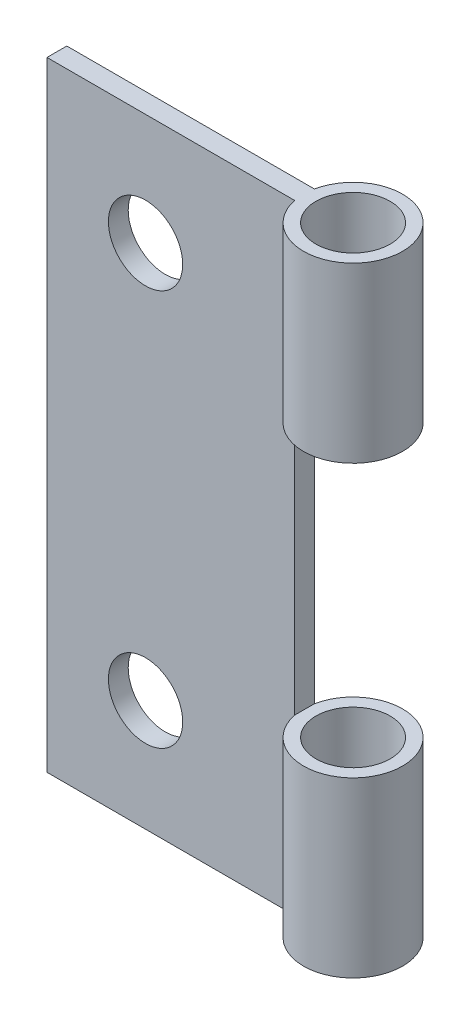
ISO-10303-21;
HEADER;
FILE_DESCRIPTION(('STEP AP214'),'2;1');
FILE_NAME('part.step','',(''),(''),'','','');
FILE_SCHEMA(('AUTOMOTIVE_DESIGN { 1 0 10303 214 1 1 1 1 }'));
ENDSEC;
DATA;
#1=APPLICATION_CONTEXT('core data for automotive mechanical design processes');
#2=APPLICATION_PROTOCOL_DEFINITION('international standard','automotive_design',2000,#1);
#3=PRODUCT_CONTEXT('',#1,'mechanical');
#4=PRODUCT('Part','Part','',(#3));
#5=PRODUCT_RELATED_PRODUCT_CATEGORY('part','',(#4));
#6=PRODUCT_DEFINITION_FORMATION('','',#4);
#7=PRODUCT_DEFINITION_CONTEXT('part definition',#1,'design');
#8=PRODUCT_DEFINITION('design','',#6,#7);
#9=PRODUCT_DEFINITION_SHAPE('','',#8);
#10=(LENGTH_UNIT() NAMED_UNIT(*) SI_UNIT(.MILLI.,.METRE.));
#11=(NAMED_UNIT(*) PLANE_ANGLE_UNIT() SI_UNIT($,.RADIAN.));
#12=(NAMED_UNIT(*) SI_UNIT($,.STERADIAN.) SOLID_ANGLE_UNIT());
#13=UNCERTAINTY_MEASURE_WITH_UNIT(LENGTH_MEASURE(1.E-05),#10,'distance_accuracy_value','');
#14=(GEOMETRIC_REPRESENTATION_CONTEXT(3) GLOBAL_UNCERTAINTY_ASSIGNED_CONTEXT((#13)) GLOBAL_UNIT_ASSIGNED_CONTEXT((#10,
#11,#12)) REPRESENTATION_CONTEXT('',''));
#15=CARTESIAN_POINT('',(0.,0.,0.));
#16=DIRECTION('',(0.,0.,1.));
#17=DIRECTION('',(1.,0.,0.));
#18=AXIS2_PLACEMENT_3D('',#15,#16,#17);
#19=CARTESIAN_POINT('',(5.,-12.5,0.8));
#20=DIRECTION('',(-1.,0.,0.));
#21=DIRECTION('',(0.,0.,1.));
#22=AXIS2_PLACEMENT_3D('',#19,#20,#21);
#23=PLANE('',#22);
#24=DIRECTION('',(0.,0.,-1.));
#25=VECTOR('',#24,1.);
#26=CARTESIAN_POINT('',(5.,5.5,0.8));
#27=LINE('',#26,#25);
#28=CARTESIAN_POINT('',(5.,5.5,0.8));
#29=VERTEX_POINT('',#28);
#30=CARTESIAN_POINT('',(5.,5.5,0.));
#31=VERTEX_POINT('',#30);
#32=EDGE_CURVE('E54',#29,#31,#27,.T.);
#33=ORIENTED_EDGE('',*,*,#32,.F.);
#34=DIRECTION('',(0.,1.,0.));
#35=VECTOR('',#34,1.);
#36=CARTESIAN_POINT('',(5.,-12.5,0.8));
#37=LINE('',#36,#35);
#38=CARTESIAN_POINT('',(5.,-5.5,0.8));
#39=VERTEX_POINT('',#38);
#40=EDGE_CURVE('E143',#39,#29,#37,.T.);
#41=ORIENTED_EDGE('',*,*,#40,.F.);
#42=DIRECTION('',(0.,0.,1.));
#43=VECTOR('',#42,1.);
#44=CARTESIAN_POINT('',(5.,-5.5,0.8));
#45=LINE('',#44,#43);
#46=CARTESIAN_POINT('',(5.,-5.5,0.));
#47=VERTEX_POINT('',#46);
#48=EDGE_CURVE('E109',#47,#39,#45,.T.);
#49=ORIENTED_EDGE('',*,*,#48,.F.);
#50=DIRECTION('',(0.,1.,0.));
#51=VECTOR('',#50,1.);
#52=CARTESIAN_POINT('',(5.,-12.5,0.));
#53=LINE('',#52,#51);
#54=EDGE_CURVE('E108',#47,#31,#53,.T.);
#55=ORIENTED_EDGE('',*,*,#54,.T.);
#56=EDGE_LOOP('',(#33,#41,#49,#55));
#57=FACE_BOUND('',#56,.T.);
#58=ADVANCED_FACE('F40',(#57),#23,.F.);
#59=CARTESIAN_POINT('',(-5.,12.5,0.8));
#60=DIRECTION('',(0.,-1.,0.));
#61=DIRECTION('',(0.,0.,-1.));
#62=AXIS2_PLACEMENT_3D('',#59,#60,#61);
#63=PLANE('',#62);
#64=DIRECTION('',(-1.,0.,0.));
#65=VECTOR('',#64,1.);
#66=CARTESIAN_POINT('',(-5.,12.5,0.8));
#67=LINE('',#66,#65);
#68=CARTESIAN_POINT('',(5.,12.5,0.8));
#69=VERTEX_POINT('',#68);
#70=CARTESIAN_POINT('',(-5.,12.5,0.8));
#71=VERTEX_POINT('',#70);
#72=EDGE_CURVE('E114',#69,#71,#67,.T.);
#73=ORIENTED_EDGE('',*,*,#72,.F.);
#74=CARTESIAN_POINT('',(6.95959179422654,12.5,0.4));
#75=DIRECTION('',(0.,-1.,0.));
#76=DIRECTION('',(0.,0.,-1.));
#77=AXIS2_PLACEMENT_3D('',#74,#75,#76);
#78=CIRCLE('',#77,2.);
#79=CARTESIAN_POINT('',(5.,12.5,0.));
#80=VERTEX_POINT('',#79);
#81=EDGE_CURVE('E105',#80,#69,#78,.T.);
#82=ORIENTED_EDGE('',*,*,#81,.F.);
#83=DIRECTION('',(-1.,0.,0.));
#84=VECTOR('',#83,1.);
#85=CARTESIAN_POINT('',(-5.,12.5,0.));
#86=LINE('',#85,#84);
#87=CARTESIAN_POINT('',(-5.,12.5,0.));
#88=VERTEX_POINT('',#87);
#89=EDGE_CURVE('E90',#80,#88,#86,.T.);
#90=ORIENTED_EDGE('',*,*,#89,.T.);
#91=DIRECTION('',(0.,0.,-1.));
#92=VECTOR('',#91,1.);
#93=CARTESIAN_POINT('',(-5.,12.5,0.8));
#94=LINE('',#93,#92);
#95=EDGE_CURVE('E11',#71,#88,#94,.T.);
#96=ORIENTED_EDGE('',*,*,#95,.F.);
#97=EDGE_LOOP('',(#73,#82,#90,#96));
#98=FACE_BOUND('',#97,.T.);
#99=CARTESIAN_POINT('',(6.95959179422654,12.5,0.4));
#100=DIRECTION('',(0.,-1.,0.));
#101=DIRECTION('',(0.,0.,-1.));
#102=AXIS2_PLACEMENT_3D('',#99,#100,#101);
#103=CIRCLE('',#102,1.5);
#104=CARTESIAN_POINT('',(6.95959179422654,12.5,-1.1));
#105=VERTEX_POINT('',#104);
#106=EDGE_CURVE('E120',#105,#105,#103,.T.);
#107=ORIENTED_EDGE('',*,*,#106,.T.);
#108=EDGE_LOOP('',(#107));
#109=FACE_BOUND('',#108,.T.);
#110=ADVANCED_FACE('F112',(#98,#109),#63,.F.);
#111=CARTESIAN_POINT('',(-5.,-12.5,0.8));
#112=DIRECTION('',(1.,0.,0.));
#113=DIRECTION('',(0.,0.,-1.));
#114=AXIS2_PLACEMENT_3D('',#111,#112,#113);
#115=PLANE('',#114);
#116=DIRECTION('',(0.,-1.,0.));
#117=VECTOR('',#116,1.);
#118=CARTESIAN_POINT('',(-5.,-12.5,0.));
#119=LINE('',#118,#117);
#120=CARTESIAN_POINT('',(-5.,-12.5,0.));
#121=VERTEX_POINT('',#120);
#122=EDGE_CURVE('E94',#88,#121,#119,.T.);
#123=ORIENTED_EDGE('',*,*,#122,.T.);
#124=DIRECTION('',(0.,0.,-1.));
#125=VECTOR('',#124,1.);
#126=CARTESIAN_POINT('',(-5.,-12.5,0.8));
#127=LINE('',#126,#125);
#128=CARTESIAN_POINT('',(-5.,-12.5,0.8));
#129=VERTEX_POINT('',#128);
#130=EDGE_CURVE('E47',#129,#121,#127,.T.);
#131=ORIENTED_EDGE('',*,*,#130,.F.);
#132=DIRECTION('',(0.,-1.,0.));
#133=VECTOR('',#132,1.);
#134=CARTESIAN_POINT('',(-5.,-12.5,0.8));
#135=LINE('',#134,#133);
#136=EDGE_CURVE('E145',#71,#129,#135,.T.);
#137=ORIENTED_EDGE('',*,*,#136,.F.);
#138=ORIENTED_EDGE('',*,*,#95,.T.);
#139=EDGE_LOOP('',(#123,#131,#137,#138));
#140=FACE_BOUND('',#139,.T.);
#141=ADVANCED_FACE('F190',(#140),#115,.F.);
#142=CARTESIAN_POINT('',(-5.,-12.5,0.8));
#143=DIRECTION('',(0.,1.,0.));
#144=DIRECTION('',(0.,0.,1.));
#145=AXIS2_PLACEMENT_3D('',#142,#143,#144);
#146=PLANE('',#145);
#147=DIRECTION('',(1.,0.,0.));
#148=VECTOR('',#147,1.);
#149=CARTESIAN_POINT('',(-5.,-12.5,0.));
#150=LINE('',#149,#148);
#151=CARTESIAN_POINT('',(5.,-12.5,0.));
#152=VERTEX_POINT('',#151);
#153=EDGE_CURVE('E151',#121,#152,#150,.T.);
#154=ORIENTED_EDGE('',*,*,#153,.T.);
#155=CARTESIAN_POINT('',(6.95959179422654,-12.5,0.4));
#156=DIRECTION('',(0.,-1.,0.));
#157=DIRECTION('',(0.,0.,-1.));
#158=AXIS2_PLACEMENT_3D('',#155,#156,#157);
#159=CIRCLE('',#158,2.);
#160=CARTESIAN_POINT('',(5.,-12.5,0.8));
#161=VERTEX_POINT('',#160);
#162=EDGE_CURVE('E130',#152,#161,#159,.T.);
#163=ORIENTED_EDGE('',*,*,#162,.T.);
#164=DIRECTION('',(1.,0.,0.));
#165=VECTOR('',#164,1.);
#166=CARTESIAN_POINT('',(-5.,-12.5,0.8));
#167=LINE('',#166,#165);
#168=EDGE_CURVE('E147',#129,#161,#167,.T.);
#169=ORIENTED_EDGE('',*,*,#168,.F.);
#170=ORIENTED_EDGE('',*,*,#130,.T.);
#171=EDGE_LOOP('',(#154,#163,#169,#170));
#172=FACE_BOUND('',#171,.T.);
#173=CARTESIAN_POINT('',(6.95959179422654,-12.5,0.4));
#174=DIRECTION('',(0.,-1.,0.));
#175=DIRECTION('',(0.,0.,-1.));
#176=AXIS2_PLACEMENT_3D('',#173,#174,#175);
#177=CIRCLE('',#176,1.5);
#178=CARTESIAN_POINT('',(6.95959179422654,-12.5,-1.1));
#179=VERTEX_POINT('',#178);
#180=EDGE_CURVE('E126',#179,#179,#177,.T.);
#181=ORIENTED_EDGE('',*,*,#180,.F.);
#182=EDGE_LOOP('',(#181));
#183=FACE_BOUND('',#182,.T.);
#184=ADVANCED_FACE('F156',(#172,#183),#146,.F.);
#185=CARTESIAN_POINT('',(0.,0.,0.8));
#186=DIRECTION('',(0.,0.,-1.));
#187=DIRECTION('',(-1.,0.,0.));
#188=AXIS2_PLACEMENT_3D('',#185,#186,#187);
#189=PLANE('',#188);
#190=CARTESIAN_POINT('',(-1.02020410288673,8.,0.8));
#191=DIRECTION('',(0.,0.,1.));
#192=DIRECTION('',(1.,0.,0.));
#193=AXIS2_PLACEMENT_3D('',#190,#191,#192);
#194=CIRCLE('',#193,1.5);
#195=CARTESIAN_POINT('',(0.479795897113271,8.,0.8));
#196=VERTEX_POINT('',#195);
#197=EDGE_CURVE('E336',#196,#196,#194,.T.);
#198=ORIENTED_EDGE('',*,*,#197,.F.);
#199=EDGE_LOOP('',(#198));
#200=FACE_BOUND('',#199,.T.);
#201=CARTESIAN_POINT('',(-1.02020410288673,-8.,0.8));
#202=DIRECTION('',(0.,0.,1.));
#203=DIRECTION('',(1.,0.,0.));
#204=AXIS2_PLACEMENT_3D('',#201,#202,#203);
#205=CIRCLE('',#204,1.5);
#206=CARTESIAN_POINT('',(0.479795897113271,-8.,0.8));
#207=VERTEX_POINT('',#206);
#208=EDGE_CURVE('E342',#207,#207,#205,.T.);
#209=ORIENTED_EDGE('',*,*,#208,.F.);
#210=EDGE_LOOP('',(#209));
#211=FACE_BOUND('',#210,.T.);
#212=EDGE_CURVE('E140',#161,#39,#37,.T.);
#213=ORIENTED_EDGE('',*,*,#212,.T.);
#214=ORIENTED_EDGE('',*,*,#40,.T.);
#215=DIRECTION('',(0.,1.,0.));
#216=VECTOR('',#215,1.);
#217=CARTESIAN_POINT('',(5.,5.5,0.8));
#218=LINE('',#217,#216);
#219=EDGE_CURVE('E117',#69,#29,#218,.F.);
#220=ORIENTED_EDGE('',*,*,#219,.F.);
#221=ORIENTED_EDGE('',*,*,#72,.T.);
#222=ORIENTED_EDGE('',*,*,#136,.T.);
#223=ORIENTED_EDGE('',*,*,#168,.T.);
#224=EDGE_LOOP('',(#213,#214,#220,#221,#222,#223));
#225=FACE_BOUND('',#224,.T.);
#226=ADVANCED_FACE('F167',(#200,#211,#225),#189,.F.);
#227=CARTESIAN_POINT('',(0.,0.,0.));
#228=DIRECTION('',(0.,0.,-1.));
#229=DIRECTION('',(-1.,0.,0.));
#230=AXIS2_PLACEMENT_3D('',#227,#228,#229);
#231=PLANE('',#230);
#232=CARTESIAN_POINT('',(-1.02020410288673,8.,0.));
#233=DIRECTION('',(0.,0.,-1.));
#234=DIRECTION('',(-1.,0.,0.));
#235=AXIS2_PLACEMENT_3D('',#232,#233,#234);
#236=CIRCLE('',#235,1.5);
#237=CARTESIAN_POINT('',(-2.52020410288673,8.,0.));
#238=VERTEX_POINT('',#237);
#239=EDGE_CURVE('E339',#238,#238,#236,.F.);
#240=ORIENTED_EDGE('',*,*,#239,.T.);
#241=EDGE_LOOP('',(#240));
#242=FACE_BOUND('',#241,.T.);
#243=CARTESIAN_POINT('',(-1.02020410288673,-8.,0.));
#244=DIRECTION('',(0.,0.,-1.));
#245=DIRECTION('',(-1.,0.,0.));
#246=AXIS2_PLACEMENT_3D('',#243,#244,#245);
#247=CIRCLE('',#246,1.5);
#248=CARTESIAN_POINT('',(-2.52020410288673,-8.,0.));
#249=VERTEX_POINT('',#248);
#250=EDGE_CURVE('E345',#249,#249,#247,.F.);
#251=ORIENTED_EDGE('',*,*,#250,.T.);
#252=EDGE_LOOP('',(#251));
#253=FACE_BOUND('',#252,.T.);
#254=EDGE_CURVE('E98',#152,#47,#53,.T.);
#255=ORIENTED_EDGE('',*,*,#254,.F.);
#256=ORIENTED_EDGE('',*,*,#153,.F.);
#257=ORIENTED_EDGE('',*,*,#122,.F.);
#258=ORIENTED_EDGE('',*,*,#89,.F.);
#259=EDGE_CURVE('E62',#31,#80,#53,.T.);
#260=ORIENTED_EDGE('',*,*,#259,.F.);
#261=ORIENTED_EDGE('',*,*,#54,.F.);
#262=EDGE_LOOP('',(#255,#256,#257,#258,#260,#261));
#263=FACE_BOUND('',#262,.T.);
#264=ADVANCED_FACE('F92',(#242,#253,#263),#231,.T.);
#265=CARTESIAN_POINT('',(6.95959179422654,-5.5,0.4));
#266=DIRECTION('',(0.,-1.,0.));
#267=DIRECTION('',(0.,0.,-1.));
#268=AXIS2_PLACEMENT_3D('',#265,#266,#267);
#269=CYLINDRICAL_SURFACE('',#268,2.);
#270=ORIENTED_EDGE('',*,*,#212,.F.);
#271=ORIENTED_EDGE('',*,*,#162,.F.);
#272=ORIENTED_EDGE('',*,*,#254,.T.);
#273=CARTESIAN_POINT('',(6.95959179422654,-5.5,0.4));
#274=DIRECTION('',(0.,-1.,0.));
#275=DIRECTION('',(0.,0.,-1.));
#276=AXIS2_PLACEMENT_3D('',#273,#274,#275);
#277=CIRCLE('',#276,2.);
#278=EDGE_CURVE('E133',#47,#39,#277,.T.);
#279=ORIENTED_EDGE('',*,*,#278,.T.);
#280=EDGE_LOOP('',(#270,#271,#272,#279));
#281=FACE_BOUND('',#280,.T.);
#282=ADVANCED_FACE('F165',(#281),#269,.T.);
#283=CARTESIAN_POINT('',(6.95959179422654,-5.5,0.4));
#284=DIRECTION('',(0.,-1.,0.));
#285=DIRECTION('',(0.,0.,-1.));
#286=AXIS2_PLACEMENT_3D('',#283,#284,#285);
#287=PLANE('',#286);
#288=CARTESIAN_POINT('',(6.95959179422654,-5.5,0.4));
#289=DIRECTION('',(0.,-1.,0.));
#290=DIRECTION('',(0.,0.,-1.));
#291=AXIS2_PLACEMENT_3D('',#288,#289,#290);
#292=CIRCLE('',#291,1.5);
#293=CARTESIAN_POINT('',(6.95959179422654,-5.5,-1.1));
#294=VERTEX_POINT('',#293);
#295=EDGE_CURVE('E127',#294,#294,#292,.T.);
#296=ORIENTED_EDGE('',*,*,#295,.T.);
#297=EDGE_LOOP('',(#296));
#298=FACE_BOUND('',#297,.T.);
#299=ORIENTED_EDGE('',*,*,#278,.F.);
#300=ORIENTED_EDGE('',*,*,#48,.T.);
#301=EDGE_LOOP('',(#299,#300));
#302=FACE_BOUND('',#301,.T.);
#303=ADVANCED_FACE('F169',(#298,#302),#287,.F.);
#304=CARTESIAN_POINT('',(6.95959179422654,-5.5,0.4));
#305=DIRECTION('',(0.,-1.,0.));
#306=DIRECTION('',(0.,0.,-1.));
#307=AXIS2_PLACEMENT_3D('',#304,#305,#306);
#308=CYLINDRICAL_SURFACE('',#307,1.5);
#309=ORIENTED_EDGE('',*,*,#295,.F.);
#310=EDGE_LOOP('',(#309));
#311=FACE_BOUND('',#310,.T.);
#312=ORIENTED_EDGE('',*,*,#180,.T.);
#313=EDGE_LOOP('',(#312));
#314=FACE_BOUND('',#313,.T.);
#315=ADVANCED_FACE('F173',(#311,#314),#308,.F.);
#316=CARTESIAN_POINT('',(6.95959179422654,5.5,0.4));
#317=DIRECTION('',(0.,1.,0.));
#318=DIRECTION('',(0.,0.,-1.));
#319=AXIS2_PLACEMENT_3D('',#316,#317,#318);
#320=PLANE('',#319);
#321=CARTESIAN_POINT('',(6.95959179422654,5.5,0.4));
#322=DIRECTION('',(0.,-1.,0.));
#323=DIRECTION('',(0.,0.,-1.));
#324=AXIS2_PLACEMENT_3D('',#321,#322,#323);
#325=CIRCLE('',#324,1.5);
#326=CARTESIAN_POINT('',(6.95959179422654,5.5,-1.1));
#327=VERTEX_POINT('',#326);
#328=EDGE_CURVE('E115',#327,#327,#325,.T.);
#329=ORIENTED_EDGE('',*,*,#328,.F.);
#330=EDGE_LOOP('',(#329));
#331=FACE_BOUND('',#330,.T.);
#332=CARTESIAN_POINT('',(6.95959179422654,5.5,0.4));
#333=DIRECTION('',(0.,-1.,0.));
#334=DIRECTION('',(0.,0.,-1.));
#335=AXIS2_PLACEMENT_3D('',#332,#333,#334);
#336=CIRCLE('',#335,2.);
#337=EDGE_CURVE('E107',#31,#29,#336,.T.);
#338=ORIENTED_EDGE('',*,*,#337,.T.);
#339=ORIENTED_EDGE('',*,*,#32,.T.);
#340=EDGE_LOOP('',(#338,#339));
#341=FACE_BOUND('',#340,.T.);
#342=ADVANCED_FACE('F171',(#331,#341),#320,.F.);
#343=CARTESIAN_POINT('',(6.95959179422654,5.5,0.4));
#344=DIRECTION('',(0.,1.,0.));
#345=DIRECTION('',(0.,0.,1.));
#346=AXIS2_PLACEMENT_3D('',#343,#344,#345);
#347=CYLINDRICAL_SURFACE('',#346,2.);
#348=ORIENTED_EDGE('',*,*,#81,.T.);
#349=ORIENTED_EDGE('',*,*,#219,.T.);
#350=ORIENTED_EDGE('',*,*,#337,.F.);
#351=ORIENTED_EDGE('',*,*,#259,.T.);
#352=EDGE_LOOP('',(#348,#349,#350,#351));
#353=FACE_BOUND('',#352,.T.);
#354=ADVANCED_FACE('F103',(#353),#347,.T.);
#355=CARTESIAN_POINT('',(6.95959179422654,5.5,0.4));
#356=DIRECTION('',(0.,1.,0.));
#357=DIRECTION('',(0.,0.,1.));
#358=AXIS2_PLACEMENT_3D('',#355,#356,#357);
#359=CYLINDRICAL_SURFACE('',#358,1.5);
#360=ORIENTED_EDGE('',*,*,#328,.T.);
#361=EDGE_LOOP('',(#360));
#362=FACE_BOUND('',#361,.T.);
#363=ORIENTED_EDGE('',*,*,#106,.F.);
#364=EDGE_LOOP('',(#363));
#365=FACE_BOUND('',#364,.T.);
#366=ADVANCED_FACE('F180',(#362,#365),#359,.F.);
#367=CARTESIAN_POINT('',(-1.02020410288673,-8.,-4.24264068711929));
#368=DIRECTION('',(0.,0.,1.));
#369=DIRECTION('',(1.,0.,0.));
#370=AXIS2_PLACEMENT_3D('',#367,#368,#369);
#371=CYLINDRICAL_SURFACE('',#370,1.5);
#372=ORIENTED_EDGE('',*,*,#208,.T.);
#373=EDGE_LOOP('',(#372));
#374=FACE_BOUND('',#373,.T.);
#375=ORIENTED_EDGE('',*,*,#250,.F.);
#376=EDGE_LOOP('',(#375));
#377=FACE_BOUND('',#376,.T.);
#378=ADVANCED_FACE('F251',(#374,#377),#371,.F.);
#379=CARTESIAN_POINT('',(-1.02020410288673,8.,-4.24264068711929));
#380=DIRECTION('',(0.,0.,1.));
#381=DIRECTION('',(1.,0.,0.));
#382=AXIS2_PLACEMENT_3D('',#379,#380,#381);
#383=CYLINDRICAL_SURFACE('',#382,1.5);
#384=ORIENTED_EDGE('',*,*,#197,.T.);
#385=EDGE_LOOP('',(#384));
#386=FACE_BOUND('',#385,.T.);
#387=ORIENTED_EDGE('',*,*,#239,.F.);
#388=EDGE_LOOP('',(#387));
#389=FACE_BOUND('',#388,.T.);
#390=ADVANCED_FACE('F277',(#386,#389),#383,.F.);
#391=CLOSED_SHELL('',(#58,#110,#141,#184,#226,#264,#282,#303,#315,#342,#354,#366,#378,#390));
#392=MANIFOLD_SOLID_BREP('B2',#391);
#393=ADVANCED_BREP_SHAPE_REPRESENTATION('',(#18,#392),#14);
#394=SHAPE_DEFINITION_REPRESENTATION(#9,#393);
ENDSEC;
END-ISO-10303-21;
